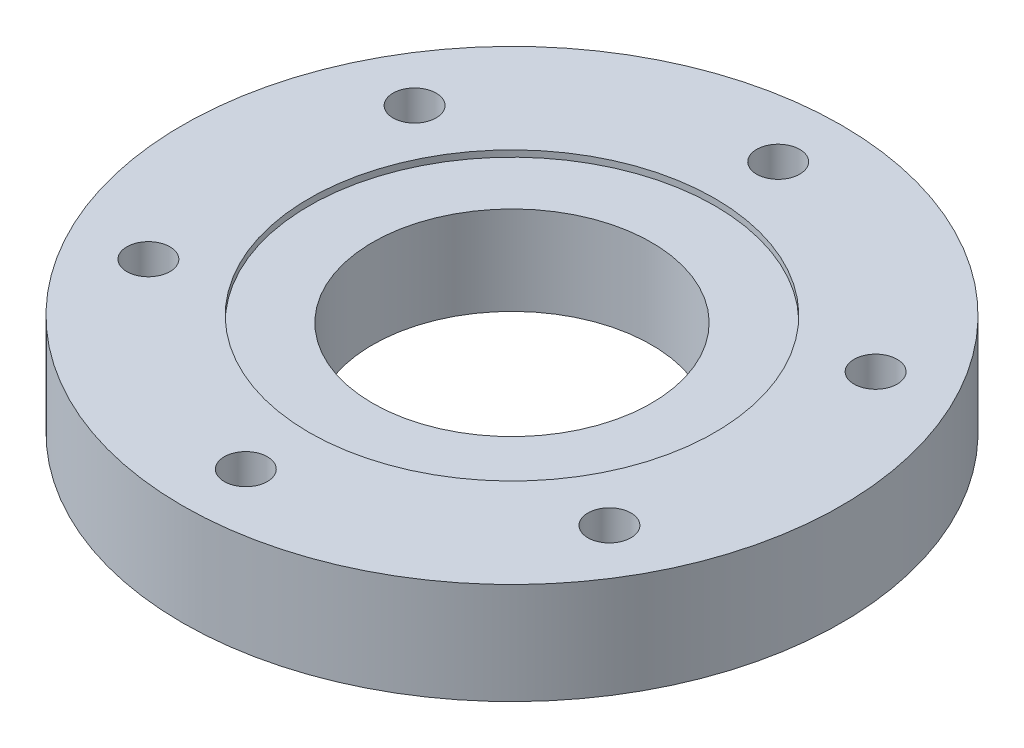
ISO-10303-21;
HEADER;
FILE_DESCRIPTION(('STEP AP214'),'2;1');
FILE_NAME('part.step','',(''),(''),'','','');
FILE_SCHEMA(('AUTOMOTIVE_DESIGN { 1 0 10303 214 1 1 1 1 }'));
ENDSEC;
DATA;
#1=APPLICATION_CONTEXT('core data for automotive mechanical design processes');
#2=APPLICATION_PROTOCOL_DEFINITION('international standard','automotive_design',2000,#1);
#3=PRODUCT_CONTEXT('',#1,'mechanical');
#4=PRODUCT('Part','Part','',(#3));
#5=PRODUCT_RELATED_PRODUCT_CATEGORY('part','',(#4));
#6=PRODUCT_DEFINITION_FORMATION('','',#4);
#7=PRODUCT_DEFINITION_CONTEXT('part definition',#1,'design');
#8=PRODUCT_DEFINITION('design','',#6,#7);
#9=PRODUCT_DEFINITION_SHAPE('','',#8);
#10=(LENGTH_UNIT() NAMED_UNIT(*) SI_UNIT(.MILLI.,.METRE.));
#11=(NAMED_UNIT(*) PLANE_ANGLE_UNIT() SI_UNIT($,.RADIAN.));
#12=(NAMED_UNIT(*) SI_UNIT($,.STERADIAN.) SOLID_ANGLE_UNIT());
#13=UNCERTAINTY_MEASURE_WITH_UNIT(LENGTH_MEASURE(1.E-05),#10,'distance_accuracy_value','');
#14=(GEOMETRIC_REPRESENTATION_CONTEXT(3) GLOBAL_UNCERTAINTY_ASSIGNED_CONTEXT((#13)) GLOBAL_UNIT_ASSIGNED_CONTEXT((#10,
#11,#12)) REPRESENTATION_CONTEXT('',''));
#15=CARTESIAN_POINT('',(0.,0.,0.));
#16=DIRECTION('',(0.,0.,1.));
#17=DIRECTION('',(1.,0.,0.));
#18=AXIS2_PLACEMENT_3D('',#15,#16,#17);
#19=CARTESIAN_POINT('',(0.,8.,0.));
#20=DIRECTION('',(0.,-1.,0.));
#21=DIRECTION('',(0.,0.,-1.));
#22=AXIS2_PLACEMENT_3D('',#19,#20,#21);
#23=CYLINDRICAL_SURFACE('',#22,16.);
#24=CARTESIAN_POINT('',(0.,0.,0.));
#25=DIRECTION('',(0.,1.,0.));
#26=DIRECTION('',(0.,0.,1.));
#27=AXIS2_PLACEMENT_3D('',#24,#25,#26);
#28=CIRCLE('',#27,16.);
#29=CARTESIAN_POINT('',(0.,0.,16.));
#30=VERTEX_POINT('',#29);
#31=EDGE_CURVE('E70',#30,#30,#28,.T.);
#32=ORIENTED_EDGE('',*,*,#31,.F.);
#33=EDGE_LOOP('',(#32));
#34=FACE_BOUND('',#33,.T.);
#35=CARTESIAN_POINT('',(0.,0.5,0.));
#36=DIRECTION('',(0.,1.,0.));
#37=DIRECTION('',(0.,0.,1.));
#38=AXIS2_PLACEMENT_3D('',#35,#36,#37);
#39=CIRCLE('',#38,16.);
#40=CARTESIAN_POINT('',(0.,0.5,16.));
#41=VERTEX_POINT('',#40);
#42=EDGE_CURVE('E138',#41,#41,#39,.T.);
#43=ORIENTED_EDGE('',*,*,#42,.T.);
#44=EDGE_LOOP('',(#43));
#45=FACE_BOUND('',#44,.T.);
#46=ADVANCED_FACE('F32',(#34,#45),#23,.F.);
#47=CARTESIAN_POINT('',(0.,8.,0.));
#48=DIRECTION('',(0.,1.,0.));
#49=DIRECTION('',(0.,0.,1.));
#50=AXIS2_PLACEMENT_3D('',#47,#48,#49);
#51=PLANE('',#50);
#52=CARTESIAN_POINT('',(-18.1865334794712,8.,-10.5000000000034));
#53=DIRECTION('',(0.,1.,0.));
#54=DIRECTION('',(0.,0.,1.));
#55=AXIS2_PLACEMENT_3D('',#52,#53,#54);
#56=CIRCLE('',#55,1.69999999999644);
#57=CARTESIAN_POINT('',(-18.1865334794712,8.,-8.80000000000701));
#58=VERTEX_POINT('',#57);
#59=EDGE_CURVE('E79',#58,#58,#56,.T.);
#60=ORIENTED_EDGE('',*,*,#59,.F.);
#61=EDGE_LOOP('',(#60));
#62=FACE_BOUND('',#61,.T.);
#63=CARTESIAN_POINT('',(-2.38221302595384E-12,8.,21.));
#64=DIRECTION('',(0.,1.,0.));
#65=DIRECTION('',(0.,0.,1.));
#66=AXIS2_PLACEMENT_3D('',#63,#64,#65);
#67=CIRCLE('',#66,1.69999999999786);
#68=CARTESIAN_POINT('',(-2.38221302595384E-12,8.,22.6999999999979));
#69=VERTEX_POINT('',#68);
#70=EDGE_CURVE('E88',#69,#69,#67,.T.);
#71=ORIENTED_EDGE('',*,*,#70,.F.);
#72=EDGE_LOOP('',(#71));
#73=FACE_BOUND('',#72,.T.);
#74=CARTESIAN_POINT('',(18.1865334794732,8.,-10.5));
#75=DIRECTION('',(0.,1.,0.));
#76=DIRECTION('',(0.,0.,1.));
#77=AXIS2_PLACEMENT_3D('',#74,#75,#76);
#78=CIRCLE('',#77,1.7);
#79=CARTESIAN_POINT('',(18.1865334794732,8.,-8.79999999999995));
#80=VERTEX_POINT('',#79);
#81=EDGE_CURVE('E93',#80,#80,#78,.T.);
#82=ORIENTED_EDGE('',*,*,#81,.F.);
#83=EDGE_LOOP('',(#82));
#84=FACE_BOUND('',#83,.T.);
#85=CARTESIAN_POINT('',(0.,8.,0.));
#86=DIRECTION('',(0.,1.,0.));
#87=DIRECTION('',(0.,0.,1.));
#88=AXIS2_PLACEMENT_3D('',#85,#86,#87);
#89=CIRCLE('',#88,26.);
#90=CARTESIAN_POINT('',(0.,8.,26.));
#91=VERTEX_POINT('',#90);
#92=EDGE_CURVE('E39',#91,#91,#89,.T.);
#93=ORIENTED_EDGE('',*,*,#92,.T.);
#94=EDGE_LOOP('',(#93));
#95=FACE_BOUND('',#94,.T.);
#96=CARTESIAN_POINT('',(0.,8.,-21.));
#97=DIRECTION('',(0.,1.,0.));
#98=DIRECTION('',(0.,0.,1.));
#99=AXIS2_PLACEMENT_3D('',#96,#97,#98);
#100=CIRCLE('',#99,1.7);
#101=CARTESIAN_POINT('',(0.,8.,-19.3));
#102=VERTEX_POINT('',#101);
#103=EDGE_CURVE('E48',#102,#102,#100,.T.);
#104=ORIENTED_EDGE('',*,*,#103,.F.);
#105=EDGE_LOOP('',(#104));
#106=FACE_BOUND('',#105,.T.);
#107=CARTESIAN_POINT('',(18.1865334794724,8.,10.5000000000014));
#108=DIRECTION('',(0.,1.,0.));
#109=DIRECTION('',(0.,0.,1.));
#110=AXIS2_PLACEMENT_3D('',#107,#108,#109);
#111=CIRCLE('',#110,1.69999999999858);
#112=CARTESIAN_POINT('',(18.1865334794724,8.,12.2));
#113=VERTEX_POINT('',#112);
#114=EDGE_CURVE('E91',#113,#113,#111,.T.);
#115=ORIENTED_EDGE('',*,*,#114,.F.);
#116=EDGE_LOOP('',(#115));
#117=FACE_BOUND('',#116,.T.);
#118=CARTESIAN_POINT('',(-18.1865334794748,8.,10.4999999999972));
#119=DIRECTION('',(0.,1.,0.));
#120=DIRECTION('',(0.,0.,1.));
#121=AXIS2_PLACEMENT_3D('',#118,#119,#120);
#122=CIRCLE('',#121,1.69999999999714);
#123=CARTESIAN_POINT('',(-18.1865334794748,8.,12.1999999999944));
#124=VERTEX_POINT('',#123);
#125=EDGE_CURVE('E85',#124,#124,#122,.T.);
#126=ORIENTED_EDGE('',*,*,#125,.F.);
#127=EDGE_LOOP('',(#126));
#128=FACE_BOUND('',#127,.T.);
#129=CARTESIAN_POINT('',(0.,8.,0.));
#130=DIRECTION('',(0.,1.,0.));
#131=DIRECTION('',(0.,0.,1.));
#132=AXIS2_PLACEMENT_3D('',#129,#130,#131);
#133=CIRCLE('',#132,16.);
#134=CARTESIAN_POINT('',(0.,8.,16.));
#135=VERTEX_POINT('',#134);
#136=EDGE_CURVE('E74',#135,#135,#133,.T.);
#137=ORIENTED_EDGE('',*,*,#136,.F.);
#138=EDGE_LOOP('',(#137));
#139=FACE_BOUND('',#138,.T.);
#140=ADVANCED_FACE('F102',(#62,#73,#84,#95,#106,#117,#128,#139),#51,.T.);
#141=CARTESIAN_POINT('',(0.,0.,0.));
#142=DIRECTION('',(0.,1.,0.));
#143=DIRECTION('',(0.,0.,1.));
#144=AXIS2_PLACEMENT_3D('',#141,#142,#143);
#145=PLANE('',#144);
#146=CARTESIAN_POINT('',(0.,0.,-21.));
#147=DIRECTION('',(0.,1.,0.));
#148=DIRECTION('',(0.,0.,1.));
#149=AXIS2_PLACEMENT_3D('',#146,#147,#148);
#150=CIRCLE('',#149,3.25);
#151=CARTESIAN_POINT('',(0.,0.,-17.75));
#152=VERTEX_POINT('',#151);
#153=EDGE_CURVE('E153',#152,#152,#150,.T.);
#154=ORIENTED_EDGE('',*,*,#153,.T.);
#155=EDGE_LOOP('',(#154));
#156=FACE_BOUND('',#155,.T.);
#157=CARTESIAN_POINT('',(-18.1865334794709,0.,-10.5000000000041));
#158=DIRECTION('',(0.,1.,0.));
#159=DIRECTION('',(0.,0.,1.));
#160=AXIS2_PLACEMENT_3D('',#157,#158,#159);
#161=CIRCLE('',#160,3.24999999999572);
#162=CARTESIAN_POINT('',(-18.1865334794709,0.,-7.25000000000837));
#163=VERTEX_POINT('',#162);
#164=EDGE_CURVE('E140',#163,#163,#161,.T.);
#165=ORIENTED_EDGE('',*,*,#164,.T.);
#166=EDGE_LOOP('',(#165));
#167=FACE_BOUND('',#166,.T.);
#168=CARTESIAN_POINT('',(-18.1865334794751,0.,10.4999999999967));
#169=DIRECTION('',(0.,1.,0.));
#170=DIRECTION('',(0.,0.,1.));
#171=AXIS2_PLACEMENT_3D('',#168,#169,#170);
#172=CIRCLE('',#171,3.24999999999657);
#173=CARTESIAN_POINT('',(-18.1865334794751,0.,13.7499999999933));
#174=VERTEX_POINT('',#173);
#175=EDGE_CURVE('E158',#174,#174,#172,.T.);
#176=ORIENTED_EDGE('',*,*,#175,.T.);
#177=EDGE_LOOP('',(#176));
#178=FACE_BOUND('',#177,.T.);
#179=CARTESIAN_POINT('',(-2.82985494948271E-12,0.,21.));
#180=DIRECTION('',(0.,1.,0.));
#181=DIRECTION('',(0.,0.,1.));
#182=AXIS2_PLACEMENT_3D('',#179,#180,#181);
#183=CIRCLE('',#182,3.24999999999744);
#184=CARTESIAN_POINT('',(-2.82985494948271E-12,0.,24.2499999999974));
#185=VERTEX_POINT('',#184);
#186=EDGE_CURVE('E174',#185,#185,#183,.T.);
#187=ORIENTED_EDGE('',*,*,#186,.T.);
#188=EDGE_LOOP('',(#187));
#189=FACE_BOUND('',#188,.T.);
#190=CARTESIAN_POINT('',(18.1865334794723,0.,10.5000000000016));
#191=DIRECTION('',(0.,1.,0.));
#192=DIRECTION('',(0.,0.,1.));
#193=AXIS2_PLACEMENT_3D('',#190,#191,#192);
#194=CIRCLE('',#193,3.24999999999829);
#195=CARTESIAN_POINT('',(18.1865334794723,0.,13.7499999999999));
#196=VERTEX_POINT('',#195);
#197=EDGE_CURVE('E168',#196,#196,#194,.T.);
#198=ORIENTED_EDGE('',*,*,#197,.T.);
#199=EDGE_LOOP('',(#198));
#200=FACE_BOUND('',#199,.T.);
#201=CARTESIAN_POINT('',(18.1865334794737,0.,-10.4999999999992));
#202=DIRECTION('',(0.,1.,0.));
#203=DIRECTION('',(0.,0.,1.));
#204=AXIS2_PLACEMENT_3D('',#201,#202,#203);
#205=CIRCLE('',#204,3.24999999999914);
#206=CARTESIAN_POINT('',(18.1865334794737,0.,-7.25000000000004));
#207=VERTEX_POINT('',#206);
#208=EDGE_CURVE('E162',#207,#207,#205,.T.);
#209=ORIENTED_EDGE('',*,*,#208,.T.);
#210=EDGE_LOOP('',(#209));
#211=FACE_BOUND('',#210,.T.);
#212=CARTESIAN_POINT('',(0.,0.,0.));
#213=DIRECTION('',(0.,1.,0.));
#214=DIRECTION('',(0.,0.,1.));
#215=AXIS2_PLACEMENT_3D('',#212,#213,#214);
#216=CIRCLE('',#215,26.);
#217=CARTESIAN_POINT('',(0.,0.,26.));
#218=VERTEX_POINT('',#217);
#219=EDGE_CURVE('E43',#218,#218,#216,.T.);
#220=ORIENTED_EDGE('',*,*,#219,.F.);
#221=EDGE_LOOP('',(#220));
#222=FACE_BOUND('',#221,.T.);
#223=ORIENTED_EDGE('',*,*,#31,.T.);
#224=EDGE_LOOP('',(#223));
#225=FACE_BOUND('',#224,.T.);
#226=ADVANCED_FACE('F105',(#156,#167,#178,#189,#200,#211,#222,#225),#145,.F.);
#227=CARTESIAN_POINT('',(0.,8.,0.));
#228=DIRECTION('',(0.,-1.,0.));
#229=DIRECTION('',(0.,0.,-1.));
#230=AXIS2_PLACEMENT_3D('',#227,#228,#229);
#231=CYLINDRICAL_SURFACE('',#230,26.);
#232=ORIENTED_EDGE('',*,*,#92,.F.);
#233=EDGE_LOOP('',(#232));
#234=FACE_BOUND('',#233,.T.);
#235=ORIENTED_EDGE('',*,*,#219,.T.);
#236=EDGE_LOOP('',(#235));
#237=FACE_BOUND('',#236,.T.);
#238=ADVANCED_FACE('F34',(#234,#237),#231,.T.);
#239=CARTESIAN_POINT('',(0.,8.,-21.));
#240=DIRECTION('',(0.,-1.,0.));
#241=DIRECTION('',(0.,0.,-1.));
#242=AXIS2_PLACEMENT_3D('',#239,#240,#241);
#243=CYLINDRICAL_SURFACE('',#242,1.7);
#244=CARTESIAN_POINT('',(0.,3.3,-21.));
#245=DIRECTION('',(0.,1.,0.));
#246=DIRECTION('',(0.,0.,1.));
#247=AXIS2_PLACEMENT_3D('',#244,#245,#246);
#248=CIRCLE('',#247,1.7);
#249=CARTESIAN_POINT('',(0.,3.3,-19.3));
#250=VERTEX_POINT('',#249);
#251=EDGE_CURVE('E68',#250,#250,#248,.T.);
#252=ORIENTED_EDGE('',*,*,#251,.F.);
#253=EDGE_LOOP('',(#252));
#254=FACE_BOUND('',#253,.T.);
#255=ORIENTED_EDGE('',*,*,#103,.T.);
#256=EDGE_LOOP('',(#255));
#257=FACE_BOUND('',#256,.T.);
#258=ADVANCED_FACE('F100',(#254,#257),#243,.F.);
#259=CARTESIAN_POINT('',(18.1865334794732,8.,-10.5));
#260=DIRECTION('',(0.,-1.,0.));
#261=DIRECTION('',(0.,0.,-1.));
#262=AXIS2_PLACEMENT_3D('',#259,#260,#261);
#263=CYLINDRICAL_SURFACE('',#262,1.7);
#264=CARTESIAN_POINT('',(18.1865334794732,3.3,-10.5));
#265=DIRECTION('',(0.,1.,0.));
#266=DIRECTION('',(0.,0.,1.));
#267=AXIS2_PLACEMENT_3D('',#264,#265,#266);
#268=CIRCLE('',#267,1.7);
#269=CARTESIAN_POINT('',(18.1865334794732,3.3,-8.79999999999995));
#270=VERTEX_POINT('',#269);
#271=EDGE_CURVE('E66',#270,#270,#268,.T.);
#272=ORIENTED_EDGE('',*,*,#271,.F.);
#273=EDGE_LOOP('',(#272));
#274=FACE_BOUND('',#273,.T.);
#275=ORIENTED_EDGE('',*,*,#81,.T.);
#276=EDGE_LOOP('',(#275));
#277=FACE_BOUND('',#276,.T.);
#278=ADVANCED_FACE('F341',(#274,#277),#263,.F.);
#279=CARTESIAN_POINT('',(18.1865334794724,8.,10.5000000000014));
#280=DIRECTION('',(0.,-1.,0.));
#281=DIRECTION('',(0.,0.,-1.));
#282=AXIS2_PLACEMENT_3D('',#279,#280,#281);
#283=CYLINDRICAL_SURFACE('',#282,1.69999999999858);
#284=CARTESIAN_POINT('',(18.1865334794724,3.3,10.5000000000014));
#285=DIRECTION('',(0.,1.,0.));
#286=DIRECTION('',(0.,0.,1.));
#287=AXIS2_PLACEMENT_3D('',#284,#285,#286);
#288=CIRCLE('',#287,1.69999999999858);
#289=CARTESIAN_POINT('',(18.1865334794724,3.3,12.2));
#290=VERTEX_POINT('',#289);
#291=EDGE_CURVE('E63',#290,#290,#288,.T.);
#292=ORIENTED_EDGE('',*,*,#291,.F.);
#293=EDGE_LOOP('',(#292));
#294=FACE_BOUND('',#293,.T.);
#295=ORIENTED_EDGE('',*,*,#114,.T.);
#296=EDGE_LOOP('',(#295));
#297=FACE_BOUND('',#296,.T.);
#298=ADVANCED_FACE('F331',(#294,#297),#283,.F.);
#299=CARTESIAN_POINT('',(-2.38221302595384E-12,8.,21.));
#300=DIRECTION('',(0.,-1.,0.));
#301=DIRECTION('',(0.,0.,-1.));
#302=AXIS2_PLACEMENT_3D('',#299,#300,#301);
#303=CYLINDRICAL_SURFACE('',#302,1.69999999999786);
#304=CARTESIAN_POINT('',(-2.38221302595384E-12,3.3,21.));
#305=DIRECTION('',(0.,1.,0.));
#306=DIRECTION('',(0.,0.,1.));
#307=AXIS2_PLACEMENT_3D('',#304,#305,#306);
#308=CIRCLE('',#307,1.69999999999786);
#309=CARTESIAN_POINT('',(-2.38221302595384E-12,3.3,22.6999999999979));
#310=VERTEX_POINT('',#309);
#311=EDGE_CURVE('E60',#310,#310,#308,.T.);
#312=ORIENTED_EDGE('',*,*,#311,.F.);
#313=EDGE_LOOP('',(#312));
#314=FACE_BOUND('',#313,.T.);
#315=ORIENTED_EDGE('',*,*,#70,.T.);
#316=EDGE_LOOP('',(#315));
#317=FACE_BOUND('',#316,.T.);
#318=ADVANCED_FACE('F321',(#314,#317),#303,.F.);
#319=CARTESIAN_POINT('',(-18.1865334794748,8.,10.4999999999972));
#320=DIRECTION('',(0.,-1.,0.));
#321=DIRECTION('',(0.,0.,-1.));
#322=AXIS2_PLACEMENT_3D('',#319,#320,#321);
#323=CYLINDRICAL_SURFACE('',#322,1.69999999999714);
#324=CARTESIAN_POINT('',(-18.1865334794748,3.3,10.4999999999972));
#325=DIRECTION('',(0.,1.,0.));
#326=DIRECTION('',(0.,0.,1.));
#327=AXIS2_PLACEMENT_3D('',#324,#325,#326);
#328=CIRCLE('',#327,1.69999999999714);
#329=CARTESIAN_POINT('',(-18.1865334794748,3.3,12.1999999999944));
#330=VERTEX_POINT('',#329);
#331=EDGE_CURVE('E56',#330,#330,#328,.T.);
#332=ORIENTED_EDGE('',*,*,#331,.F.);
#333=EDGE_LOOP('',(#332));
#334=FACE_BOUND('',#333,.T.);
#335=ORIENTED_EDGE('',*,*,#125,.T.);
#336=EDGE_LOOP('',(#335));
#337=FACE_BOUND('',#336,.T.);
#338=ADVANCED_FACE('F127',(#334,#337),#323,.F.);
#339=CARTESIAN_POINT('',(-18.1865334794712,8.,-10.5000000000034));
#340=DIRECTION('',(0.,-1.,0.));
#341=DIRECTION('',(0.,0.,-1.));
#342=AXIS2_PLACEMENT_3D('',#339,#340,#341);
#343=CYLINDRICAL_SURFACE('',#342,1.69999999999644);
#344=CARTESIAN_POINT('',(-18.1865334794712,3.3,-10.5000000000034));
#345=DIRECTION('',(0.,1.,0.));
#346=DIRECTION('',(0.,0.,1.));
#347=AXIS2_PLACEMENT_3D('',#344,#345,#346);
#348=CIRCLE('',#347,1.69999999999644);
#349=CARTESIAN_POINT('',(-18.1865334794712,3.3,-8.80000000000701));
#350=VERTEX_POINT('',#349);
#351=EDGE_CURVE('E53',#350,#350,#348,.T.);
#352=ORIENTED_EDGE('',*,*,#351,.F.);
#353=EDGE_LOOP('',(#352));
#354=FACE_BOUND('',#353,.T.);
#355=ORIENTED_EDGE('',*,*,#59,.T.);
#356=EDGE_LOOP('',(#355));
#357=FACE_BOUND('',#356,.T.);
#358=ADVANCED_FACE('F117',(#354,#357),#343,.F.);
#359=CARTESIAN_POINT('',(0.,7.5,0.));
#360=DIRECTION('',(0.,1.,0.));
#361=DIRECTION('',(0.,0.,1.));
#362=AXIS2_PLACEMENT_3D('',#359,#360,#361);
#363=CIRCLE('',#362,16.);
#364=CARTESIAN_POINT('',(0.,7.5,16.));
#365=VERTEX_POINT('',#364);
#366=EDGE_CURVE('E10',#365,#365,#363,.T.);
#367=ORIENTED_EDGE('',*,*,#366,.F.);
#368=EDGE_LOOP('',(#367));
#369=FACE_BOUND('',#368,.T.);
#370=ORIENTED_EDGE('',*,*,#136,.T.);
#371=EDGE_LOOP('',(#370));
#372=FACE_BOUND('',#371,.T.);
#373=ADVANCED_FACE('F114',(#369,#372),#23,.F.);
#374=CARTESIAN_POINT('',(-18.1865334794709,3.3,-10.5000000000041));
#375=DIRECTION('',(0.,-1.,0.));
#376=DIRECTION('',(0.,0.,-1.));
#377=AXIS2_PLACEMENT_3D('',#374,#375,#376);
#378=CYLINDRICAL_SURFACE('',#377,3.24999999999572);
#379=CARTESIAN_POINT('',(-18.1865334794709,3.3,-10.5000000000041));
#380=DIRECTION('',(0.,1.,0.));
#381=DIRECTION('',(0.,0.,1.));
#382=AXIS2_PLACEMENT_3D('',#379,#380,#381);
#383=CIRCLE('',#382,3.24999999999572);
#384=CARTESIAN_POINT('',(-18.1865334794709,3.3,-7.25000000000837));
#385=VERTEX_POINT('',#384);
#386=EDGE_CURVE('E144',#385,#385,#383,.T.);
#387=ORIENTED_EDGE('',*,*,#386,.T.);
#388=EDGE_LOOP('',(#387));
#389=FACE_BOUND('',#388,.T.);
#390=ORIENTED_EDGE('',*,*,#164,.F.);
#391=EDGE_LOOP('',(#390));
#392=FACE_BOUND('',#391,.T.);
#393=ADVANCED_FACE('F116',(#389,#392),#378,.F.);
#394=CARTESIAN_POINT('',(-18.1865334794709,3.3,-10.5000000000041));
#395=DIRECTION('',(0.,1.,0.));
#396=DIRECTION('',(0.,0.,1.));
#397=AXIS2_PLACEMENT_3D('',#394,#395,#396);
#398=PLANE('',#397);
#399=ORIENTED_EDGE('',*,*,#351,.T.);
#400=EDGE_LOOP('',(#399));
#401=FACE_BOUND('',#400,.T.);
#402=ORIENTED_EDGE('',*,*,#386,.F.);
#403=EDGE_LOOP('',(#402));
#404=FACE_BOUND('',#403,.T.);
#405=ADVANCED_FACE('F124',(#401,#404),#398,.F.);
#406=CARTESIAN_POINT('',(-18.1865334794751,3.3,10.4999999999967));
#407=DIRECTION('',(0.,-1.,0.));
#408=DIRECTION('',(0.,0.,-1.));
#409=AXIS2_PLACEMENT_3D('',#406,#407,#408);
#410=CYLINDRICAL_SURFACE('',#409,3.24999999999657);
#411=CARTESIAN_POINT('',(-18.1865334794751,3.3,10.4999999999967));
#412=DIRECTION('',(0.,1.,0.));
#413=DIRECTION('',(0.,0.,1.));
#414=AXIS2_PLACEMENT_3D('',#411,#412,#413);
#415=CIRCLE('',#414,3.24999999999657);
#416=CARTESIAN_POINT('',(-18.1865334794751,3.3,13.7499999999933));
#417=VERTEX_POINT('',#416);
#418=EDGE_CURVE('E177',#417,#417,#415,.T.);
#419=ORIENTED_EDGE('',*,*,#418,.T.);
#420=EDGE_LOOP('',(#419));
#421=FACE_BOUND('',#420,.T.);
#422=ORIENTED_EDGE('',*,*,#175,.F.);
#423=EDGE_LOOP('',(#422));
#424=FACE_BOUND('',#423,.T.);
#425=ADVANCED_FACE('F184',(#421,#424),#410,.F.);
#426=CARTESIAN_POINT('',(-18.1865334794751,3.3,10.4999999999967));
#427=DIRECTION('',(0.,1.,0.));
#428=DIRECTION('',(0.,0.,1.));
#429=AXIS2_PLACEMENT_3D('',#426,#427,#428);
#430=PLANE('',#429);
#431=ORIENTED_EDGE('',*,*,#331,.T.);
#432=EDGE_LOOP('',(#431));
#433=FACE_BOUND('',#432,.T.);
#434=ORIENTED_EDGE('',*,*,#418,.F.);
#435=EDGE_LOOP('',(#434));
#436=FACE_BOUND('',#435,.T.);
#437=ADVANCED_FACE('F186',(#433,#436),#430,.F.);
#438=CARTESIAN_POINT('',(-2.82985494948271E-12,3.3,21.));
#439=DIRECTION('',(0.,-1.,0.));
#440=DIRECTION('',(0.,0.,-1.));
#441=AXIS2_PLACEMENT_3D('',#438,#439,#440);
#442=CYLINDRICAL_SURFACE('',#441,3.24999999999744);
#443=CARTESIAN_POINT('',(-2.82985494948271E-12,3.3,21.));
#444=DIRECTION('',(0.,1.,0.));
#445=DIRECTION('',(0.,0.,1.));
#446=AXIS2_PLACEMENT_3D('',#443,#444,#445);
#447=CIRCLE('',#446,3.24999999999744);
#448=CARTESIAN_POINT('',(-2.82985494948271E-12,3.3,24.2499999999974));
#449=VERTEX_POINT('',#448);
#450=EDGE_CURVE('E171',#449,#449,#447,.T.);
#451=ORIENTED_EDGE('',*,*,#450,.T.);
#452=EDGE_LOOP('',(#451));
#453=FACE_BOUND('',#452,.T.);
#454=ORIENTED_EDGE('',*,*,#186,.F.);
#455=EDGE_LOOP('',(#454));
#456=FACE_BOUND('',#455,.T.);
#457=ADVANCED_FACE('F192',(#453,#456),#442,.F.);
#458=CARTESIAN_POINT('',(-2.82985494948271E-12,3.3,21.));
#459=DIRECTION('',(0.,1.,0.));
#460=DIRECTION('',(0.,0.,1.));
#461=AXIS2_PLACEMENT_3D('',#458,#459,#460);
#462=PLANE('',#461);
#463=ORIENTED_EDGE('',*,*,#311,.T.);
#464=EDGE_LOOP('',(#463));
#465=FACE_BOUND('',#464,.T.);
#466=ORIENTED_EDGE('',*,*,#450,.F.);
#467=EDGE_LOOP('',(#466));
#468=FACE_BOUND('',#467,.T.);
#469=ADVANCED_FACE('F200',(#465,#468),#462,.F.);
#470=CARTESIAN_POINT('',(18.1865334794723,3.3,10.5000000000016));
#471=DIRECTION('',(0.,-1.,0.));
#472=DIRECTION('',(0.,0.,-1.));
#473=AXIS2_PLACEMENT_3D('',#470,#471,#472);
#474=CYLINDRICAL_SURFACE('',#473,3.24999999999829);
#475=CARTESIAN_POINT('',(18.1865334794723,3.3,10.5000000000016));
#476=DIRECTION('',(0.,1.,0.));
#477=DIRECTION('',(0.,0.,1.));
#478=AXIS2_PLACEMENT_3D('',#475,#476,#477);
#479=CIRCLE('',#478,3.24999999999829);
#480=CARTESIAN_POINT('',(18.1865334794723,3.3,13.7499999999999));
#481=VERTEX_POINT('',#480);
#482=EDGE_CURVE('E165',#481,#481,#479,.T.);
#483=ORIENTED_EDGE('',*,*,#482,.T.);
#484=EDGE_LOOP('',(#483));
#485=FACE_BOUND('',#484,.T.);
#486=ORIENTED_EDGE('',*,*,#197,.F.);
#487=EDGE_LOOP('',(#486));
#488=FACE_BOUND('',#487,.T.);
#489=ADVANCED_FACE('F204',(#485,#488),#474,.F.);
#490=CARTESIAN_POINT('',(18.1865334794723,3.3,10.5000000000016));
#491=DIRECTION('',(0.,1.,0.));
#492=DIRECTION('',(0.,0.,1.));
#493=AXIS2_PLACEMENT_3D('',#490,#491,#492);
#494=PLANE('',#493);
#495=ORIENTED_EDGE('',*,*,#291,.T.);
#496=EDGE_LOOP('',(#495));
#497=FACE_BOUND('',#496,.T.);
#498=ORIENTED_EDGE('',*,*,#482,.F.);
#499=EDGE_LOOP('',(#498));
#500=FACE_BOUND('',#499,.T.);
#501=ADVANCED_FACE('F208',(#497,#500),#494,.F.);
#502=CARTESIAN_POINT('',(18.1865334794737,3.3,-10.4999999999992));
#503=DIRECTION('',(0.,-1.,0.));
#504=DIRECTION('',(0.,0.,-1.));
#505=AXIS2_PLACEMENT_3D('',#502,#503,#504);
#506=CYLINDRICAL_SURFACE('',#505,3.24999999999914);
#507=CARTESIAN_POINT('',(18.1865334794737,3.3,-10.4999999999992));
#508=DIRECTION('',(0.,1.,0.));
#509=DIRECTION('',(0.,0.,1.));
#510=AXIS2_PLACEMENT_3D('',#507,#508,#509);
#511=CIRCLE('',#510,3.24999999999914);
#512=CARTESIAN_POINT('',(18.1865334794737,3.3,-7.25000000000004));
#513=VERTEX_POINT('',#512);
#514=EDGE_CURVE('E156',#513,#513,#511,.T.);
#515=ORIENTED_EDGE('',*,*,#514,.T.);
#516=EDGE_LOOP('',(#515));
#517=FACE_BOUND('',#516,.T.);
#518=ORIENTED_EDGE('',*,*,#208,.F.);
#519=EDGE_LOOP('',(#518));
#520=FACE_BOUND('',#519,.T.);
#521=ADVANCED_FACE('F212',(#517,#520),#506,.F.);
#522=CARTESIAN_POINT('',(18.1865334794737,3.3,-10.4999999999992));
#523=DIRECTION('',(0.,1.,0.));
#524=DIRECTION('',(0.,0.,1.));
#525=AXIS2_PLACEMENT_3D('',#522,#523,#524);
#526=PLANE('',#525);
#527=ORIENTED_EDGE('',*,*,#271,.T.);
#528=EDGE_LOOP('',(#527));
#529=FACE_BOUND('',#528,.T.);
#530=ORIENTED_EDGE('',*,*,#514,.F.);
#531=EDGE_LOOP('',(#530));
#532=FACE_BOUND('',#531,.T.);
#533=ADVANCED_FACE('F216',(#529,#532),#526,.F.);
#534=CARTESIAN_POINT('',(0.,3.3,-21.));
#535=DIRECTION('',(0.,-1.,0.));
#536=DIRECTION('',(0.,0.,-1.));
#537=AXIS2_PLACEMENT_3D('',#534,#535,#536);
#538=CYLINDRICAL_SURFACE('',#537,3.25);
#539=CARTESIAN_POINT('',(0.,3.3,-21.));
#540=DIRECTION('',(0.,1.,0.));
#541=DIRECTION('',(0.,0.,1.));
#542=AXIS2_PLACEMENT_3D('',#539,#540,#541);
#543=CIRCLE('',#542,3.25);
#544=CARTESIAN_POINT('',(0.,3.3,-17.75));
#545=VERTEX_POINT('',#544);
#546=EDGE_CURVE('E57',#545,#545,#543,.T.);
#547=ORIENTED_EDGE('',*,*,#546,.T.);
#548=EDGE_LOOP('',(#547));
#549=FACE_BOUND('',#548,.T.);
#550=ORIENTED_EDGE('',*,*,#153,.F.);
#551=EDGE_LOOP('',(#550));
#552=FACE_BOUND('',#551,.T.);
#553=ADVANCED_FACE('F219',(#549,#552),#538,.F.);
#554=CARTESIAN_POINT('',(0.,3.3,-21.));
#555=DIRECTION('',(0.,1.,0.));
#556=DIRECTION('',(0.,0.,1.));
#557=AXIS2_PLACEMENT_3D('',#554,#555,#556);
#558=PLANE('',#557);
#559=ORIENTED_EDGE('',*,*,#251,.T.);
#560=EDGE_LOOP('',(#559));
#561=FACE_BOUND('',#560,.T.);
#562=ORIENTED_EDGE('',*,*,#546,.F.);
#563=EDGE_LOOP('',(#562));
#564=FACE_BOUND('',#563,.T.);
#565=ADVANCED_FACE('F224',(#561,#564),#558,.F.);
#566=CARTESIAN_POINT('',(0.,7.5,0.));
#567=DIRECTION('',(0.,1.,0.));
#568=DIRECTION('',(0.,0.,1.));
#569=AXIS2_PLACEMENT_3D('',#566,#567,#568);
#570=PLANE('',#569);
#571=ORIENTED_EDGE('',*,*,#366,.T.);
#572=EDGE_LOOP('',(#571));
#573=FACE_BOUND('',#572,.T.);
#574=CARTESIAN_POINT('',(0.,7.5,0.));
#575=DIRECTION('',(0.,1.,0.));
#576=DIRECTION('',(0.,0.,1.));
#577=AXIS2_PLACEMENT_3D('',#574,#575,#576);
#578=CIRCLE('',#577,11.);
#579=CARTESIAN_POINT('',(0.,7.5,11.));
#580=VERTEX_POINT('',#579);
#581=EDGE_CURVE('E141',#580,#580,#578,.T.);
#582=ORIENTED_EDGE('',*,*,#581,.F.);
#583=EDGE_LOOP('',(#582));
#584=FACE_BOUND('',#583,.T.);
#585=ADVANCED_FACE('F228',(#573,#584),#570,.T.);
#586=CARTESIAN_POINT('',(0.,0.5,0.));
#587=DIRECTION('',(0.,1.,0.));
#588=DIRECTION('',(0.,0.,1.));
#589=AXIS2_PLACEMENT_3D('',#586,#587,#588);
#590=PLANE('',#589);
#591=ORIENTED_EDGE('',*,*,#42,.F.);
#592=EDGE_LOOP('',(#591));
#593=FACE_BOUND('',#592,.T.);
#594=CARTESIAN_POINT('',(0.,0.5,0.));
#595=DIRECTION('',(0.,1.,0.));
#596=DIRECTION('',(0.,0.,1.));
#597=AXIS2_PLACEMENT_3D('',#594,#595,#596);
#598=CIRCLE('',#597,11.);
#599=CARTESIAN_POINT('',(0.,0.5,11.));
#600=VERTEX_POINT('',#599);
#601=EDGE_CURVE('E147',#600,#600,#598,.T.);
#602=ORIENTED_EDGE('',*,*,#601,.T.);
#603=EDGE_LOOP('',(#602));
#604=FACE_BOUND('',#603,.T.);
#605=ADVANCED_FACE('F229',(#593,#604),#590,.F.);
#606=CARTESIAN_POINT('',(0.,7.5,0.));
#607=DIRECTION('',(0.,-1.,0.));
#608=DIRECTION('',(0.,0.,-1.));
#609=AXIS2_PLACEMENT_3D('',#606,#607,#608);
#610=CYLINDRICAL_SURFACE('',#609,11.);
#611=ORIENTED_EDGE('',*,*,#581,.T.);
#612=EDGE_LOOP('',(#611));
#613=FACE_BOUND('',#612,.T.);
#614=ORIENTED_EDGE('',*,*,#601,.F.);
#615=EDGE_LOOP('',(#614));
#616=FACE_BOUND('',#615,.T.);
#617=ADVANCED_FACE('F232',(#613,#616),#610,.F.);
#618=CLOSED_SHELL('',(#46,#140,#226,#238,#258,#278,#298,#318,#338,#358,#373,#393,#405,#425,#437,
#457,#469,#489,#501,#521,#533,#553,#565,#585,#605,#617));
#619=MANIFOLD_SOLID_BREP('B2',#618);
#620=ADVANCED_BREP_SHAPE_REPRESENTATION('',(#18,#619),#14);
#621=SHAPE_DEFINITION_REPRESENTATION(#9,#620);
ENDSEC;
END-ISO-10303-21;
